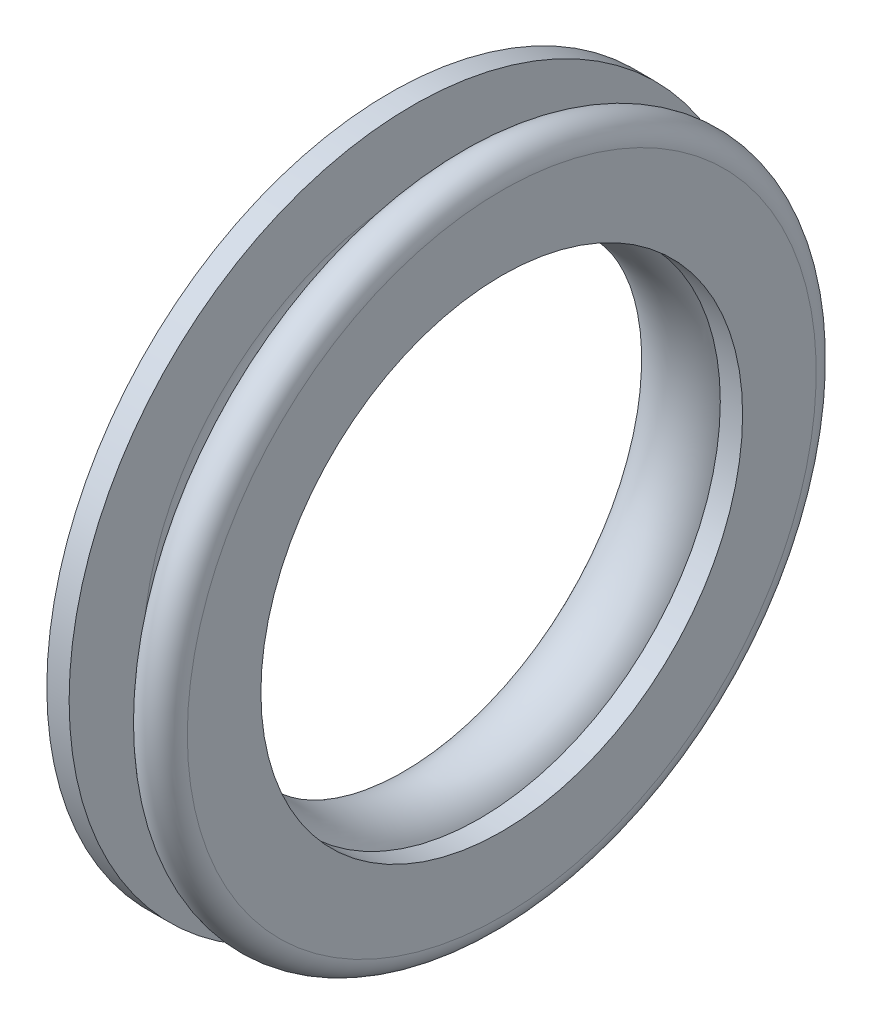
ISO-10303-21;
HEADER;
FILE_DESCRIPTION(('STEP AP214'),'2;1');
FILE_NAME('part.step','',(''),(''),'','','');
FILE_SCHEMA(('AUTOMOTIVE_DESIGN { 1 0 10303 214 1 1 1 1 }'));
ENDSEC;
DATA;
#1=APPLICATION_CONTEXT('core data for automotive mechanical design processes');
#2=APPLICATION_PROTOCOL_DEFINITION('international standard','automotive_design',2000,#1);
#3=PRODUCT_CONTEXT('',#1,'mechanical');
#4=PRODUCT('Part','Part','',(#3));
#5=PRODUCT_RELATED_PRODUCT_CATEGORY('part','',(#4));
#6=PRODUCT_DEFINITION_FORMATION('','',#4);
#7=PRODUCT_DEFINITION_CONTEXT('part definition',#1,'design');
#8=PRODUCT_DEFINITION('design','',#6,#7);
#9=PRODUCT_DEFINITION_SHAPE('','',#8);
#10=(LENGTH_UNIT() NAMED_UNIT(*) SI_UNIT(.MILLI.,.METRE.));
#11=(NAMED_UNIT(*) PLANE_ANGLE_UNIT() SI_UNIT($,.RADIAN.));
#12=(NAMED_UNIT(*) SI_UNIT($,.STERADIAN.) SOLID_ANGLE_UNIT());
#13=UNCERTAINTY_MEASURE_WITH_UNIT(LENGTH_MEASURE(1.E-05),#10,'distance_accuracy_value','');
#14=(GEOMETRIC_REPRESENTATION_CONTEXT(3) GLOBAL_UNCERTAINTY_ASSIGNED_CONTEXT((#13)) GLOBAL_UNIT_ASSIGNED_CONTEXT((#10,
#11,#12)) REPRESENTATION_CONTEXT('',''));
#15=CARTESIAN_POINT('',(0.,0.,0.));
#16=DIRECTION('',(0.,0.,1.));
#17=DIRECTION('',(1.,0.,0.));
#18=AXIS2_PLACEMENT_3D('',#15,#16,#17);
#19=CARTESIAN_POINT('',(0.,0.,0.));
#20=DIRECTION('',(-1.,0.,0.));
#21=DIRECTION('',(0.,0.,1.));
#22=AXIS2_PLACEMENT_3D('',#19,#20,#21);
#23=CYLINDRICAL_SURFACE('',#22,7.7);
#24=CARTESIAN_POINT('',(0.,0.,0.));
#25=DIRECTION('',(-1.,0.,0.));
#26=DIRECTION('',(0.,0.,1.));
#27=AXIS2_PLACEMENT_3D('',#24,#25,#26);
#28=CIRCLE('',#27,7.7);
#29=CARTESIAN_POINT('',(0.,0.,7.7));
#30=VERTEX_POINT('',#29);
#31=EDGE_CURVE('E10',#30,#30,#28,.T.);
#32=ORIENTED_EDGE('',*,*,#31,.F.);
#33=EDGE_LOOP('',(#32));
#34=FACE_BOUND('',#33,.T.);
#35=CARTESIAN_POINT('',(0.5,0.,0.));
#36=DIRECTION('',(-1.,0.,0.));
#37=DIRECTION('',(0.,0.,1.));
#38=AXIS2_PLACEMENT_3D('',#35,#36,#37);
#39=CIRCLE('',#38,7.7);
#40=CARTESIAN_POINT('',(0.5,0.,7.7));
#41=VERTEX_POINT('',#40);
#42=EDGE_CURVE('E71',#41,#41,#39,.T.);
#43=ORIENTED_EDGE('',*,*,#42,.T.);
#44=EDGE_LOOP('',(#43));
#45=FACE_BOUND('',#44,.T.);
#46=ADVANCED_FACE('F37',(#34,#45),#23,.T.);
#47=CARTESIAN_POINT('',(0.,7.7,0.));
#48=DIRECTION('',(1.,0.,0.));
#49=DIRECTION('',(0.,0.,-1.));
#50=AXIS2_PLACEMENT_3D('',#47,#48,#49);
#51=PLANE('',#50);
#52=CARTESIAN_POINT('',(0.,0.,0.));
#53=DIRECTION('',(-1.,0.,0.));
#54=DIRECTION('',(0.,0.,1.));
#55=AXIS2_PLACEMENT_3D('',#52,#53,#54);
#56=CIRCLE('',#55,6.05);
#57=CARTESIAN_POINT('',(0.,0.,6.05));
#58=VERTEX_POINT('',#57);
#59=EDGE_CURVE('E43',#58,#58,#56,.T.);
#60=ORIENTED_EDGE('',*,*,#59,.F.);
#61=EDGE_LOOP('',(#60));
#62=FACE_BOUND('',#61,.T.);
#63=ORIENTED_EDGE('',*,*,#31,.T.);
#64=EDGE_LOOP('',(#63));
#65=FACE_BOUND('',#64,.T.);
#66=ADVANCED_FACE('F120',(#62,#65),#51,.F.);
#67=CARTESIAN_POINT('',(1.,0.,0.));
#68=DIRECTION('',(-1.,0.,0.));
#69=DIRECTION('',(0.,0.,1.));
#70=AXIS2_PLACEMENT_3D('',#67,#68,#69);
#71=TOROIDAL_SURFACE('',#70,6.05,1.);
#72=CARTESIAN_POINT('',(2.,0.,0.));
#73=DIRECTION('',(-1.,0.,0.));
#74=DIRECTION('',(0.,0.,1.));
#75=AXIS2_PLACEMENT_3D('',#72,#73,#74);
#76=CIRCLE('',#75,6.05);
#77=CARTESIAN_POINT('',(2.,0.,6.05));
#78=VERTEX_POINT('',#77);
#79=EDGE_CURVE('E47',#78,#78,#76,.T.);
#80=ORIENTED_EDGE('',*,*,#79,.F.);
#81=EDGE_LOOP('',(#80));
#82=FACE_BOUND('',#81,.T.);
#83=ORIENTED_EDGE('',*,*,#59,.T.);
#84=EDGE_LOOP('',(#83));
#85=FACE_BOUND('',#84,.T.);
#86=ADVANCED_FACE('F115',(#82,#85),#71,.T.);
#87=CARTESIAN_POINT('',(2.,6.05,0.));
#88=DIRECTION('',(1.,0.,0.));
#89=DIRECTION('',(0.,0.,-1.));
#90=AXIS2_PLACEMENT_3D('',#87,#88,#89);
#91=PLANE('',#90);
#92=CARTESIAN_POINT('',(2.,0.,0.));
#93=DIRECTION('',(-1.,0.,0.));
#94=DIRECTION('',(0.,0.,1.));
#95=AXIS2_PLACEMENT_3D('',#92,#93,#94);
#96=CIRCLE('',#95,5.4);
#97=CARTESIAN_POINT('',(2.,0.,5.4));
#98=VERTEX_POINT('',#97);
#99=EDGE_CURVE('E51',#98,#98,#96,.T.);
#100=ORIENTED_EDGE('',*,*,#99,.F.);
#101=EDGE_LOOP('',(#100));
#102=FACE_BOUND('',#101,.T.);
#103=ORIENTED_EDGE('',*,*,#79,.T.);
#104=EDGE_LOOP('',(#103));
#105=FACE_BOUND('',#104,.T.);
#106=ADVANCED_FACE('F109',(#102,#105),#91,.F.);
#107=CARTESIAN_POINT('',(0.,0.,0.));
#108=DIRECTION('',(-1.,0.,0.));
#109=DIRECTION('',(0.,0.,1.));
#110=AXIS2_PLACEMENT_3D('',#107,#108,#109);
#111=CYLINDRICAL_SURFACE('',#110,5.4);
#112=CARTESIAN_POINT('',(2.5,0.,0.));
#113=DIRECTION('',(-1.,0.,0.));
#114=DIRECTION('',(0.,0.,1.));
#115=AXIS2_PLACEMENT_3D('',#112,#113,#114);
#116=CIRCLE('',#115,5.4);
#117=CARTESIAN_POINT('',(2.5,0.,5.4));
#118=VERTEX_POINT('',#117);
#119=EDGE_CURVE('E56',#118,#118,#116,.T.);
#120=ORIENTED_EDGE('',*,*,#119,.F.);
#121=EDGE_LOOP('',(#120));
#122=FACE_BOUND('',#121,.T.);
#123=ORIENTED_EDGE('',*,*,#99,.T.);
#124=EDGE_LOOP('',(#123));
#125=FACE_BOUND('',#124,.T.);
#126=ADVANCED_FACE('F103',(#122,#125),#111,.F.);
#127=CARTESIAN_POINT('',(2.5,7.05,0.));
#128=DIRECTION('',(-1.,0.,0.));
#129=DIRECTION('',(0.,0.,1.));
#130=AXIS2_PLACEMENT_3D('',#127,#128,#129);
#131=PLANE('',#130);
#132=CARTESIAN_POINT('',(2.5,0.,0.));
#133=DIRECTION('',(-1.,0.,0.));
#134=DIRECTION('',(0.,0.,1.));
#135=AXIS2_PLACEMENT_3D('',#132,#133,#134);
#136=CIRCLE('',#135,7.05);
#137=CARTESIAN_POINT('',(2.5,0.,7.05));
#138=VERTEX_POINT('',#137);
#139=EDGE_CURVE('E59',#138,#138,#136,.T.);
#140=ORIENTED_EDGE('',*,*,#139,.F.);
#141=EDGE_LOOP('',(#140));
#142=FACE_BOUND('',#141,.T.);
#143=ORIENTED_EDGE('',*,*,#119,.T.);
#144=EDGE_LOOP('',(#143));
#145=FACE_BOUND('',#144,.T.);
#146=ADVANCED_FACE('F97',(#142,#145),#131,.F.);
#147=CARTESIAN_POINT('',(2.,0.,0.));
#148=DIRECTION('',(-1.,0.,0.));
#149=DIRECTION('',(0.,0.,1.));
#150=AXIS2_PLACEMENT_3D('',#147,#148,#149);
#151=TOROIDAL_SURFACE('',#150,7.05,0.5);
#152=CARTESIAN_POINT('',(1.5,0.,0.));
#153=DIRECTION('',(-1.,0.,0.));
#154=DIRECTION('',(0.,0.,1.));
#155=AXIS2_PLACEMENT_3D('',#152,#153,#154);
#156=CIRCLE('',#155,7.05);
#157=CARTESIAN_POINT('',(1.5,0.,7.05));
#158=VERTEX_POINT('',#157);
#159=EDGE_CURVE('E62',#158,#158,#156,.T.);
#160=ORIENTED_EDGE('',*,*,#159,.F.);
#161=EDGE_LOOP('',(#160));
#162=FACE_BOUND('',#161,.T.);
#163=ORIENTED_EDGE('',*,*,#139,.T.);
#164=EDGE_LOOP('',(#163));
#165=FACE_BOUND('',#164,.T.);
#166=ADVANCED_FACE('F91',(#162,#165),#151,.T.);
#167=CARTESIAN_POINT('',(1.5,6.05,0.));
#168=DIRECTION('',(1.,0.,0.));
#169=DIRECTION('',(0.,0.,-1.));
#170=AXIS2_PLACEMENT_3D('',#167,#168,#169);
#171=PLANE('',#170);
#172=CARTESIAN_POINT('',(1.5,0.,0.));
#173=DIRECTION('',(-1.,0.,0.));
#174=DIRECTION('',(0.,0.,1.));
#175=AXIS2_PLACEMENT_3D('',#172,#173,#174);
#176=CIRCLE('',#175,6.05);
#177=CARTESIAN_POINT('',(1.5,0.,6.05));
#178=VERTEX_POINT('',#177);
#179=EDGE_CURVE('E65',#178,#178,#176,.T.);
#180=ORIENTED_EDGE('',*,*,#179,.F.);
#181=EDGE_LOOP('',(#180));
#182=FACE_BOUND('',#181,.T.);
#183=ORIENTED_EDGE('',*,*,#159,.T.);
#184=EDGE_LOOP('',(#183));
#185=FACE_BOUND('',#184,.T.);
#186=ADVANCED_FACE('F85',(#182,#185),#171,.F.);
#187=CARTESIAN_POINT('',(1.,0.,0.));
#188=DIRECTION('',(-1.,0.,0.));
#189=DIRECTION('',(0.,0.,1.));
#190=AXIS2_PLACEMENT_3D('',#187,#188,#189);
#191=TOROIDAL_SURFACE('',#190,6.05,0.5);
#192=CARTESIAN_POINT('',(0.5,0.,0.));
#193=DIRECTION('',(-1.,0.,0.));
#194=DIRECTION('',(0.,0.,1.));
#195=AXIS2_PLACEMENT_3D('',#192,#193,#194);
#196=CIRCLE('',#195,6.05);
#197=CARTESIAN_POINT('',(0.5,0.,6.05));
#198=VERTEX_POINT('',#197);
#199=EDGE_CURVE('E68',#198,#198,#196,.T.);
#200=ORIENTED_EDGE('',*,*,#199,.F.);
#201=EDGE_LOOP('',(#200));
#202=FACE_BOUND('',#201,.T.);
#203=ORIENTED_EDGE('',*,*,#179,.T.);
#204=EDGE_LOOP('',(#203));
#205=FACE_BOUND('',#204,.T.);
#206=ADVANCED_FACE('F79',(#202,#205),#191,.F.);
#207=CARTESIAN_POINT('',(0.5,7.7,0.));
#208=DIRECTION('',(-1.,0.,0.));
#209=DIRECTION('',(0.,0.,1.));
#210=AXIS2_PLACEMENT_3D('',#207,#208,#209);
#211=PLANE('',#210);
#212=ORIENTED_EDGE('',*,*,#42,.F.);
#213=EDGE_LOOP('',(#212));
#214=FACE_BOUND('',#213,.T.);
#215=ORIENTED_EDGE('',*,*,#199,.T.);
#216=EDGE_LOOP('',(#215));
#217=FACE_BOUND('',#216,.T.);
#218=ADVANCED_FACE('F76',(#214,#217),#211,.F.);
#219=CLOSED_SHELL('',(#46,#66,#86,#106,#126,#146,#166,#186,#206,#218));
#220=MANIFOLD_SOLID_BREP('B2',#219);
#221=ADVANCED_BREP_SHAPE_REPRESENTATION('',(#18,#220),#14);
#222=SHAPE_DEFINITION_REPRESENTATION(#9,#221);
ENDSEC;
END-ISO-10303-21;
